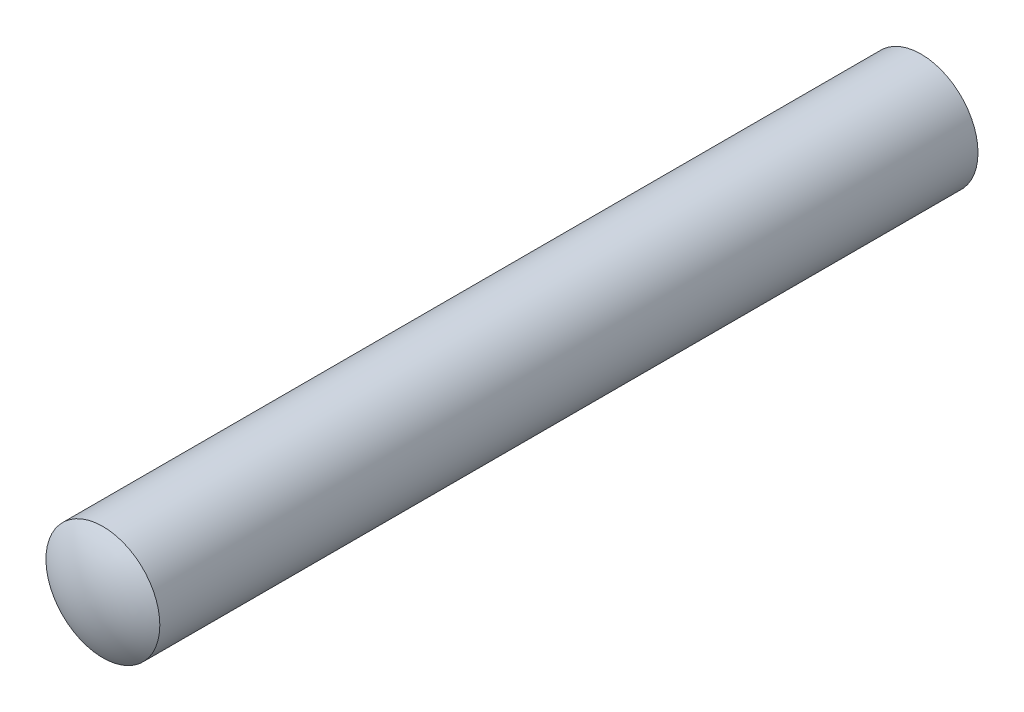
ISO-10303-21;
HEADER;
FILE_DESCRIPTION(('STEP AP214'),'2;1');
FILE_NAME('part.step','',(''),(''),'','','');
FILE_SCHEMA(('AUTOMOTIVE_DESIGN { 1 0 10303 214 1 1 1 1 }'));
ENDSEC;
DATA;
#1=APPLICATION_CONTEXT('core data for automotive mechanical design processes');
#2=APPLICATION_PROTOCOL_DEFINITION('international standard','automotive_design',2000,#1);
#3=PRODUCT_CONTEXT('',#1,'mechanical');
#4=PRODUCT('Part','Part','',(#3));
#5=PRODUCT_RELATED_PRODUCT_CATEGORY('part','',(#4));
#6=PRODUCT_DEFINITION_FORMATION('','',#4);
#7=PRODUCT_DEFINITION_CONTEXT('part definition',#1,'design');
#8=PRODUCT_DEFINITION('design','',#6,#7);
#9=PRODUCT_DEFINITION_SHAPE('','',#8);
#10=(LENGTH_UNIT() NAMED_UNIT(*) SI_UNIT(.MILLI.,.METRE.));
#11=(NAMED_UNIT(*) PLANE_ANGLE_UNIT() SI_UNIT($,.RADIAN.));
#12=(NAMED_UNIT(*) SI_UNIT($,.STERADIAN.) SOLID_ANGLE_UNIT());
#13=UNCERTAINTY_MEASURE_WITH_UNIT(LENGTH_MEASURE(1.E-05),#10,'distance_accuracy_value','');
#14=(GEOMETRIC_REPRESENTATION_CONTEXT(3) GLOBAL_UNCERTAINTY_ASSIGNED_CONTEXT((#13)) GLOBAL_UNIT_ASSIGNED_CONTEXT((#10,
#11,#12)) REPRESENTATION_CONTEXT('',''));
#15=CARTESIAN_POINT('',(0.,0.,0.));
#16=DIRECTION('',(0.,0.,1.));
#17=DIRECTION('',(1.,0.,0.));
#18=AXIS2_PLACEMENT_3D('',#15,#16,#17);
#19=CARTESIAN_POINT('',(0.,0.,11.5103968253968));
#20=DIRECTION('',(0.,0.,1.));
#21=DIRECTION('',(0.,1.,0.));
#22=AXIS2_PLACEMENT_3D('',#19,#20,#21);
#23=SPHERICAL_SURFACE('',#22,3.48960317460317);
#24=CARTESIAN_POINT('',(0.,0.,14.37));
#25=DIRECTION('',(0.,0.,1.));
#26=DIRECTION('',(1.,0.,0.));
#27=AXIS2_PLACEMENT_3D('',#24,#25,#26);
#28=CIRCLE('',#27,2.);
#29=CARTESIAN_POINT('',(2.,0.,14.37));
#30=VERTEX_POINT('',#29);
#31=EDGE_CURVE('E34',#30,#30,#28,.T.);
#32=ORIENTED_EDGE('',*,*,#31,.T.);
#33=EDGE_LOOP('',(#32));
#34=FACE_BOUND('',#33,.T.);
#35=ADVANCED_FACE('F28',(#34),#23,.T.);
#36=CARTESIAN_POINT('',(0.,0.,-11.5103968253968));
#37=DIRECTION('',(0.,0.,1.));
#38=DIRECTION('',(0.,1.,0.));
#39=AXIS2_PLACEMENT_3D('',#36,#37,#38);
#40=SPHERICAL_SURFACE('',#39,3.48960317460317);
#41=CARTESIAN_POINT('',(0.,0.,-14.37));
#42=DIRECTION('',(0.,0.,1.));
#43=DIRECTION('',(1.,0.,0.));
#44=AXIS2_PLACEMENT_3D('',#41,#42,#43);
#45=CIRCLE('',#44,2.);
#46=CARTESIAN_POINT('',(2.,0.,-14.37));
#47=VERTEX_POINT('',#46);
#48=EDGE_CURVE('E10',#47,#47,#45,.T.);
#49=ORIENTED_EDGE('',*,*,#48,.F.);
#50=EDGE_LOOP('',(#49));
#51=FACE_BOUND('',#50,.T.);
#52=ADVANCED_FACE('F43',(#51),#40,.T.);
#53=CARTESIAN_POINT('',(0.,0.,15.));
#54=DIRECTION('',(0.,0.,1.));
#55=DIRECTION('',(1.,0.,0.));
#56=AXIS2_PLACEMENT_3D('',#53,#54,#55);
#57=CYLINDRICAL_SURFACE('',#56,2.);
#58=ORIENTED_EDGE('',*,*,#31,.F.);
#59=EDGE_LOOP('',(#58));
#60=FACE_BOUND('',#59,.T.);
#61=ORIENTED_EDGE('',*,*,#48,.T.);
#62=EDGE_LOOP('',(#61));
#63=FACE_BOUND('',#62,.T.);
#64=ADVANCED_FACE('F41',(#60,#63),#57,.T.);
#65=CLOSED_SHELL('',(#35,#52,#64));
#66=MANIFOLD_SOLID_BREP('B2',#65);
#67=ADVANCED_BREP_SHAPE_REPRESENTATION('',(#18,#66),#14);
#68=SHAPE_DEFINITION_REPRESENTATION(#9,#67);
ENDSEC;
END-ISO-10303-21;
